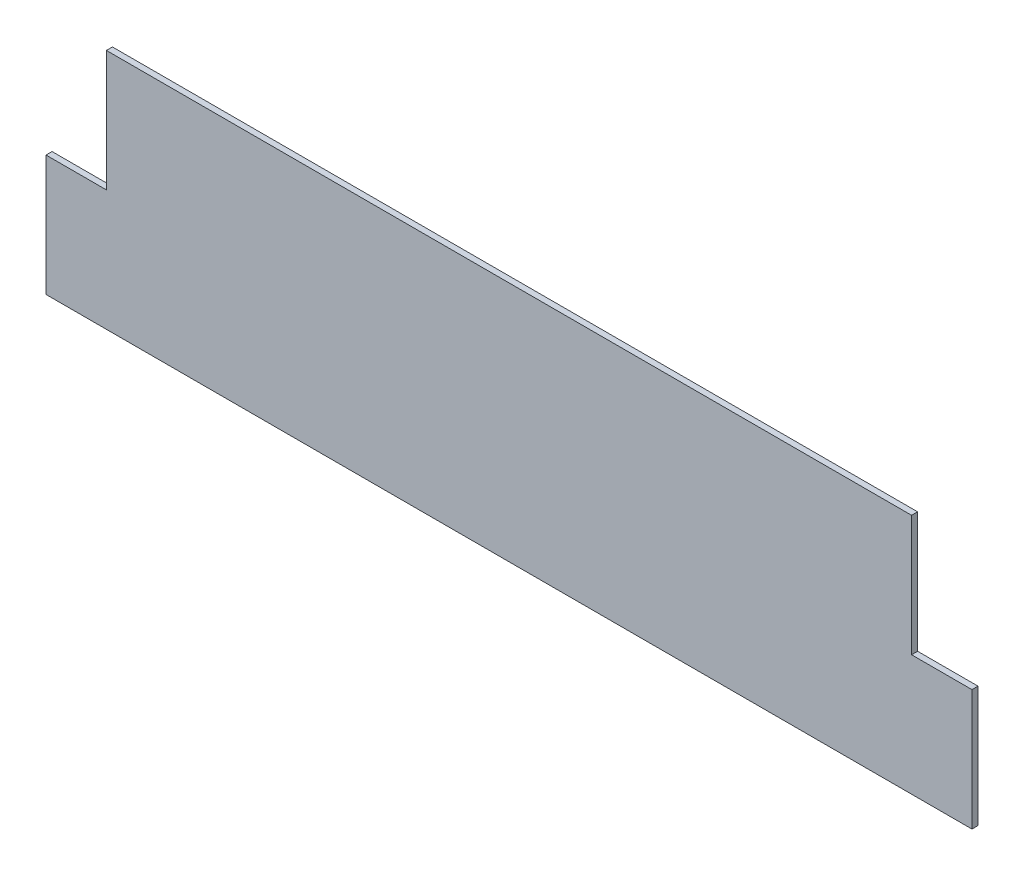
ISO-10303-21;
HEADER;
FILE_DESCRIPTION(('STEP AP214'),'2;1');
FILE_NAME('part.step','',(''),(''),'','','');
FILE_SCHEMA(('AUTOMOTIVE_DESIGN { 1 0 10303 214 1 1 1 1 }'));
ENDSEC;
DATA;
#1=APPLICATION_CONTEXT('core data for automotive mechanical design processes');
#2=APPLICATION_PROTOCOL_DEFINITION('international standard','automotive_design',2000,#1);
#3=PRODUCT_CONTEXT('',#1,'mechanical');
#4=PRODUCT('Part','Part','',(#3));
#5=PRODUCT_RELATED_PRODUCT_CATEGORY('part','',(#4));
#6=PRODUCT_DEFINITION_FORMATION('','',#4);
#7=PRODUCT_DEFINITION_CONTEXT('part definition',#1,'design');
#8=PRODUCT_DEFINITION('design','',#6,#7);
#9=PRODUCT_DEFINITION_SHAPE('','',#8);
#10=(LENGTH_UNIT() NAMED_UNIT(*) SI_UNIT(.MILLI.,.METRE.));
#11=(NAMED_UNIT(*) PLANE_ANGLE_UNIT() SI_UNIT($,.RADIAN.));
#12=(NAMED_UNIT(*) SI_UNIT($,.STERADIAN.) SOLID_ANGLE_UNIT());
#13=UNCERTAINTY_MEASURE_WITH_UNIT(LENGTH_MEASURE(1.E-05),#10,'distance_accuracy_value','');
#14=(GEOMETRIC_REPRESENTATION_CONTEXT(3) GLOBAL_UNCERTAINTY_ASSIGNED_CONTEXT((#13)) GLOBAL_UNIT_ASSIGNED_CONTEXT((#10,
#11,#12)) REPRESENTATION_CONTEXT('',''));
#15=CARTESIAN_POINT('',(0.,0.,0.));
#16=DIRECTION('',(0.,0.,1.));
#17=DIRECTION('',(1.,0.,0.));
#18=AXIS2_PLACEMENT_3D('',#15,#16,#17);
#19=CARTESIAN_POINT('',(-170.21286454225,59.9999999999999,3.));
#20=DIRECTION('',(1.,0.,0.));
#21=DIRECTION('',(0.,0.,-1.));
#22=AXIS2_PLACEMENT_3D('',#19,#20,#21);
#23=PLANE('',#22);
#24=DIRECTION('',(0.,-1.,0.));
#25=VECTOR('',#24,1.);
#26=CARTESIAN_POINT('',(-170.21286454225,59.9999999999999,0.));
#27=LINE('',#26,#25);
#28=CARTESIAN_POINT('',(-170.21286454225,59.9999999999999,0.));
#29=VERTEX_POINT('',#28);
#30=CARTESIAN_POINT('',(-170.21286454225,0.,0.));
#31=VERTEX_POINT('',#30);
#32=EDGE_CURVE('E129',#29,#31,#27,.T.);
#33=ORIENTED_EDGE('',*,*,#32,.T.);
#34=DIRECTION('',(0.,0.,-1.));
#35=VECTOR('',#34,1.);
#36=CARTESIAN_POINT('',(-170.21286454225,0.,3.));
#37=LINE('',#36,#35);
#38=CARTESIAN_POINT('',(-170.21286454225,0.,3.));
#39=VERTEX_POINT('',#38);
#40=EDGE_CURVE('E11',#39,#31,#37,.T.);
#41=ORIENTED_EDGE('',*,*,#40,.F.);
#42=DIRECTION('',(0.,-1.,0.));
#43=VECTOR('',#42,1.);
#44=CARTESIAN_POINT('',(-170.21286454225,59.9999999999999,3.));
#45=LINE('',#44,#43);
#46=CARTESIAN_POINT('',(-170.21286454225,59.9999999999999,3.));
#47=VERTEX_POINT('',#46);
#48=EDGE_CURVE('E143',#47,#39,#45,.T.);
#49=ORIENTED_EDGE('',*,*,#48,.F.);
#50=DIRECTION('',(0.,0.,-1.));
#51=VECTOR('',#50,1.);
#52=CARTESIAN_POINT('',(-170.21286454225,59.9999999999999,3.));
#53=LINE('',#52,#51);
#54=EDGE_CURVE('E125',#47,#29,#53,.T.);
#55=ORIENTED_EDGE('',*,*,#54,.T.);
#56=EDGE_LOOP('',(#33,#41,#49,#55));
#57=FACE_BOUND('',#56,.T.);
#58=ADVANCED_FACE('F33',(#57),#23,.F.);
#59=CARTESIAN_POINT('',(-170.21286454225,0.,3.));
#60=DIRECTION('',(0.,1.,0.));
#61=DIRECTION('',(0.,0.,1.));
#62=AXIS2_PLACEMENT_3D('',#59,#60,#61);
#63=PLANE('',#62);
#64=DIRECTION('',(1.,0.,0.));
#65=VECTOR('',#64,1.);
#66=CARTESIAN_POINT('',(-170.21286454225,0.,0.));
#67=LINE('',#66,#65);
#68=CARTESIAN_POINT('',(289.78713545775,0.,0.));
#69=VERTEX_POINT('',#68);
#70=EDGE_CURVE('E132',#31,#69,#67,.T.);
#71=ORIENTED_EDGE('',*,*,#70,.T.);
#72=DIRECTION('',(0.,0.,-1.));
#73=VECTOR('',#72,1.);
#74=CARTESIAN_POINT('',(289.78713545775,0.,3.));
#75=LINE('',#74,#73);
#76=CARTESIAN_POINT('',(289.78713545775,0.,3.));
#77=VERTEX_POINT('',#76);
#78=EDGE_CURVE('E41',#77,#69,#75,.T.);
#79=ORIENTED_EDGE('',*,*,#78,.F.);
#80=DIRECTION('',(1.,0.,0.));
#81=VECTOR('',#80,1.);
#82=CARTESIAN_POINT('',(-170.21286454225,0.,3.));
#83=LINE('',#82,#81);
#84=EDGE_CURVE('E92',#39,#77,#83,.T.);
#85=ORIENTED_EDGE('',*,*,#84,.F.);
#86=ORIENTED_EDGE('',*,*,#40,.T.);
#87=EDGE_LOOP('',(#71,#79,#85,#86));
#88=FACE_BOUND('',#87,.T.);
#89=ADVANCED_FACE('F178',(#88),#63,.F.);
#90=CARTESIAN_POINT('',(289.78713545775,0.,3.));
#91=DIRECTION('',(-1.,0.,0.));
#92=DIRECTION('',(0.,0.,1.));
#93=AXIS2_PLACEMENT_3D('',#90,#91,#92);
#94=PLANE('',#93);
#95=DIRECTION('',(0.,1.,0.));
#96=VECTOR('',#95,1.);
#97=CARTESIAN_POINT('',(289.78713545775,0.,0.));
#98=LINE('',#97,#96);
#99=CARTESIAN_POINT('',(289.78713545775,60.,0.));
#100=VERTEX_POINT('',#99);
#101=EDGE_CURVE('E134',#69,#100,#98,.T.);
#102=ORIENTED_EDGE('',*,*,#101,.T.);
#103=DIRECTION('',(0.,0.,-1.));
#104=VECTOR('',#103,1.);
#105=CARTESIAN_POINT('',(289.78713545775,60.,3.));
#106=LINE('',#105,#104);
#107=CARTESIAN_POINT('',(289.78713545775,60.,3.));
#108=VERTEX_POINT('',#107);
#109=EDGE_CURVE('E150',#108,#100,#106,.T.);
#110=ORIENTED_EDGE('',*,*,#109,.F.);
#111=DIRECTION('',(0.,1.,0.));
#112=VECTOR('',#111,1.);
#113=CARTESIAN_POINT('',(289.78713545775,0.,3.));
#114=LINE('',#113,#112);
#115=EDGE_CURVE('E158',#77,#108,#114,.T.);
#116=ORIENTED_EDGE('',*,*,#115,.F.);
#117=ORIENTED_EDGE('',*,*,#78,.T.);
#118=EDGE_LOOP('',(#102,#110,#116,#117));
#119=FACE_BOUND('',#118,.T.);
#120=ADVANCED_FACE('F156',(#119),#94,.F.);
#121=CARTESIAN_POINT('',(289.78713545775,60.,3.));
#122=DIRECTION('',(0.,-1.,0.));
#123=DIRECTION('',(0.,0.,-1.));
#124=AXIS2_PLACEMENT_3D('',#121,#122,#123);
#125=PLANE('',#124);
#126=DIRECTION('',(-1.,0.,0.));
#127=VECTOR('',#126,1.);
#128=CARTESIAN_POINT('',(289.78713545775,60.,0.));
#129=LINE('',#128,#127);
#130=CARTESIAN_POINT('',(259.78713545775,60.,0.));
#131=VERTEX_POINT('',#130);
#132=EDGE_CURVE('E136',#100,#131,#129,.T.);
#133=ORIENTED_EDGE('',*,*,#132,.T.);
#134=DIRECTION('',(0.,0.,-1.));
#135=VECTOR('',#134,1.);
#136=CARTESIAN_POINT('',(259.78713545775,60.,3.));
#137=LINE('',#136,#135);
#138=CARTESIAN_POINT('',(259.78713545775,60.,3.));
#139=VERTEX_POINT('',#138);
#140=EDGE_CURVE('E147',#139,#131,#137,.T.);
#141=ORIENTED_EDGE('',*,*,#140,.F.);
#142=DIRECTION('',(-1.,0.,0.));
#143=VECTOR('',#142,1.);
#144=CARTESIAN_POINT('',(289.78713545775,60.,3.));
#145=LINE('',#144,#143);
#146=EDGE_CURVE('E170',#108,#139,#145,.T.);
#147=ORIENTED_EDGE('',*,*,#146,.F.);
#148=ORIENTED_EDGE('',*,*,#109,.T.);
#149=EDGE_LOOP('',(#133,#141,#147,#148));
#150=FACE_BOUND('',#149,.T.);
#151=ADVANCED_FACE('F166',(#150),#125,.F.);
#152=CARTESIAN_POINT('',(259.78713545775,60.,3.));
#153=DIRECTION('',(-1.,0.,0.));
#154=DIRECTION('',(0.,0.,1.));
#155=AXIS2_PLACEMENT_3D('',#152,#153,#154);
#156=PLANE('',#155);
#157=DIRECTION('',(0.,1.,0.));
#158=VECTOR('',#157,1.);
#159=CARTESIAN_POINT('',(259.78713545775,60.,0.));
#160=LINE('',#159,#158);
#161=CARTESIAN_POINT('',(259.78713545775,120.,0.));
#162=VERTEX_POINT('',#161);
#163=EDGE_CURVE('E138',#131,#162,#160,.T.);
#164=ORIENTED_EDGE('',*,*,#163,.T.);
#165=DIRECTION('',(0.,0.,-1.));
#166=VECTOR('',#165,1.);
#167=CARTESIAN_POINT('',(259.78713545775,120.,3.));
#168=LINE('',#167,#166);
#169=CARTESIAN_POINT('',(259.78713545775,120.,3.));
#170=VERTEX_POINT('',#169);
#171=EDGE_CURVE('E120',#170,#162,#168,.T.);
#172=ORIENTED_EDGE('',*,*,#171,.F.);
#173=DIRECTION('',(0.,1.,0.));
#174=VECTOR('',#173,1.);
#175=CARTESIAN_POINT('',(259.78713545775,60.,3.));
#176=LINE('',#175,#174);
#177=EDGE_CURVE('E111',#139,#170,#176,.T.);
#178=ORIENTED_EDGE('',*,*,#177,.F.);
#179=ORIENTED_EDGE('',*,*,#140,.T.);
#180=EDGE_LOOP('',(#164,#172,#178,#179));
#181=FACE_BOUND('',#180,.T.);
#182=ADVANCED_FACE('F169',(#181),#156,.F.);
#183=CARTESIAN_POINT('',(259.78713545775,120.,3.));
#184=DIRECTION('',(0.,-1.,0.));
#185=DIRECTION('',(1.,0.,0.));
#186=AXIS2_PLACEMENT_3D('',#183,#184,#185);
#187=PLANE('',#186);
#188=DIRECTION('',(-1.,0.,0.));
#189=VECTOR('',#188,1.);
#190=CARTESIAN_POINT('',(259.78713545775,120.,0.));
#191=LINE('',#190,#189);
#192=CARTESIAN_POINT('',(-140.21286454225,120.,0.));
#193=VERTEX_POINT('',#192);
#194=EDGE_CURVE('E119',#162,#193,#191,.T.);
#195=ORIENTED_EDGE('',*,*,#194,.T.);
#196=DIRECTION('',(0.,0.,-1.));
#197=VECTOR('',#196,1.);
#198=CARTESIAN_POINT('',(-140.21286454225,120.,3.));
#199=LINE('',#198,#197);
#200=CARTESIAN_POINT('',(-140.21286454225,120.,3.));
#201=VERTEX_POINT('',#200);
#202=EDGE_CURVE('E116',#201,#193,#199,.T.);
#203=ORIENTED_EDGE('',*,*,#202,.F.);
#204=DIRECTION('',(-1.,0.,0.));
#205=VECTOR('',#204,1.);
#206=CARTESIAN_POINT('',(259.78713545775,120.,3.));
#207=LINE('',#206,#205);
#208=EDGE_CURVE('E105',#170,#201,#207,.T.);
#209=ORIENTED_EDGE('',*,*,#208,.F.);
#210=ORIENTED_EDGE('',*,*,#171,.T.);
#211=EDGE_LOOP('',(#195,#203,#209,#210));
#212=FACE_BOUND('',#211,.T.);
#213=ADVANCED_FACE('F117',(#212),#187,.F.);
#214=CARTESIAN_POINT('',(-140.21286454225,120.,3.));
#215=DIRECTION('',(1.,0.,0.));
#216=DIRECTION('',(0.,1.,0.));
#217=AXIS2_PLACEMENT_3D('',#214,#215,#216);
#218=PLANE('',#217);
#219=DIRECTION('',(0.,-1.,0.));
#220=VECTOR('',#219,1.);
#221=CARTESIAN_POINT('',(-140.21286454225,120.,0.));
#222=LINE('',#221,#220);
#223=CARTESIAN_POINT('',(-140.21286454225,59.9999999999999,0.));
#224=VERTEX_POINT('',#223);
#225=EDGE_CURVE('E78',#193,#224,#222,.T.);
#226=ORIENTED_EDGE('',*,*,#225,.T.);
#227=DIRECTION('',(0.,0.,-1.));
#228=VECTOR('',#227,1.);
#229=CARTESIAN_POINT('',(-140.21286454225,59.9999999999999,3.));
#230=LINE('',#229,#228);
#231=CARTESIAN_POINT('',(-140.21286454225,59.9999999999999,3.));
#232=VERTEX_POINT('',#231);
#233=EDGE_CURVE('E121',#232,#224,#230,.T.);
#234=ORIENTED_EDGE('',*,*,#233,.F.);
#235=DIRECTION('',(0.,-1.,0.));
#236=VECTOR('',#235,1.);
#237=CARTESIAN_POINT('',(-140.21286454225,120.,3.));
#238=LINE('',#237,#236);
#239=EDGE_CURVE('E109',#201,#232,#238,.T.);
#240=ORIENTED_EDGE('',*,*,#239,.F.);
#241=ORIENTED_EDGE('',*,*,#202,.T.);
#242=EDGE_LOOP('',(#226,#234,#240,#241));
#243=FACE_BOUND('',#242,.T.);
#244=ADVANCED_FACE('F123',(#243),#218,.F.);
#245=CARTESIAN_POINT('',(-140.21286454225,59.9999999999999,3.));
#246=DIRECTION('',(0.,-1.,0.));
#247=DIRECTION('',(0.,0.,-1.));
#248=AXIS2_PLACEMENT_3D('',#245,#246,#247);
#249=PLANE('',#248);
#250=DIRECTION('',(-1.,0.,0.));
#251=VECTOR('',#250,1.);
#252=CARTESIAN_POINT('',(-140.21286454225,59.9999999999999,0.));
#253=LINE('',#252,#251);
#254=EDGE_CURVE('E84',#224,#29,#253,.T.);
#255=ORIENTED_EDGE('',*,*,#254,.T.);
#256=ORIENTED_EDGE('',*,*,#54,.F.);
#257=DIRECTION('',(-1.,0.,0.));
#258=VECTOR('',#257,1.);
#259=CARTESIAN_POINT('',(-140.21286454225,59.9999999999999,3.));
#260=LINE('',#259,#258);
#261=EDGE_CURVE('E49',#232,#47,#260,.T.);
#262=ORIENTED_EDGE('',*,*,#261,.F.);
#263=ORIENTED_EDGE('',*,*,#233,.T.);
#264=EDGE_LOOP('',(#255,#256,#262,#263));
#265=FACE_BOUND('',#264,.T.);
#266=ADVANCED_FACE('F194',(#265),#249,.F.);
#267=CARTESIAN_POINT('',(0.,0.,3.));
#268=DIRECTION('',(0.,0.,1.));
#269=DIRECTION('',(1.,0.,0.));
#270=AXIS2_PLACEMENT_3D('',#267,#268,#269);
#271=PLANE('',#270);
#272=ORIENTED_EDGE('',*,*,#48,.T.);
#273=ORIENTED_EDGE('',*,*,#84,.T.);
#274=ORIENTED_EDGE('',*,*,#115,.T.);
#275=ORIENTED_EDGE('',*,*,#146,.T.);
#276=ORIENTED_EDGE('',*,*,#177,.T.);
#277=ORIENTED_EDGE('',*,*,#208,.T.);
#278=ORIENTED_EDGE('',*,*,#239,.T.);
#279=ORIENTED_EDGE('',*,*,#261,.T.);
#280=EDGE_LOOP('',(#272,#273,#274,#275,#276,#277,#278,#279));
#281=FACE_BOUND('',#280,.T.);
#282=ADVANCED_FACE('F107',(#281),#271,.T.);
#283=CARTESIAN_POINT('',(0.,0.,0.));
#284=DIRECTION('',(0.,0.,1.));
#285=DIRECTION('',(1.,0.,0.));
#286=AXIS2_PLACEMENT_3D('',#283,#284,#285);
#287=PLANE('',#286);
#288=ORIENTED_EDGE('',*,*,#32,.F.);
#289=ORIENTED_EDGE('',*,*,#254,.F.);
#290=ORIENTED_EDGE('',*,*,#225,.F.);
#291=ORIENTED_EDGE('',*,*,#194,.F.);
#292=ORIENTED_EDGE('',*,*,#163,.F.);
#293=ORIENTED_EDGE('',*,*,#132,.F.);
#294=ORIENTED_EDGE('',*,*,#101,.F.);
#295=ORIENTED_EDGE('',*,*,#70,.F.);
#296=EDGE_LOOP('',(#288,#289,#290,#291,#292,#293,#294,#295));
#297=FACE_BOUND('',#296,.T.);
#298=ADVANCED_FACE('F162',(#297),#287,.F.);
#299=CLOSED_SHELL('',(#58,#89,#120,#151,#182,#213,#244,#266,#282,#298));
#300=MANIFOLD_SOLID_BREP('B2',#299);
#301=ADVANCED_BREP_SHAPE_REPRESENTATION('',(#18,#300),#14);
#302=SHAPE_DEFINITION_REPRESENTATION(#9,#301);
ENDSEC;
END-ISO-10303-21;
